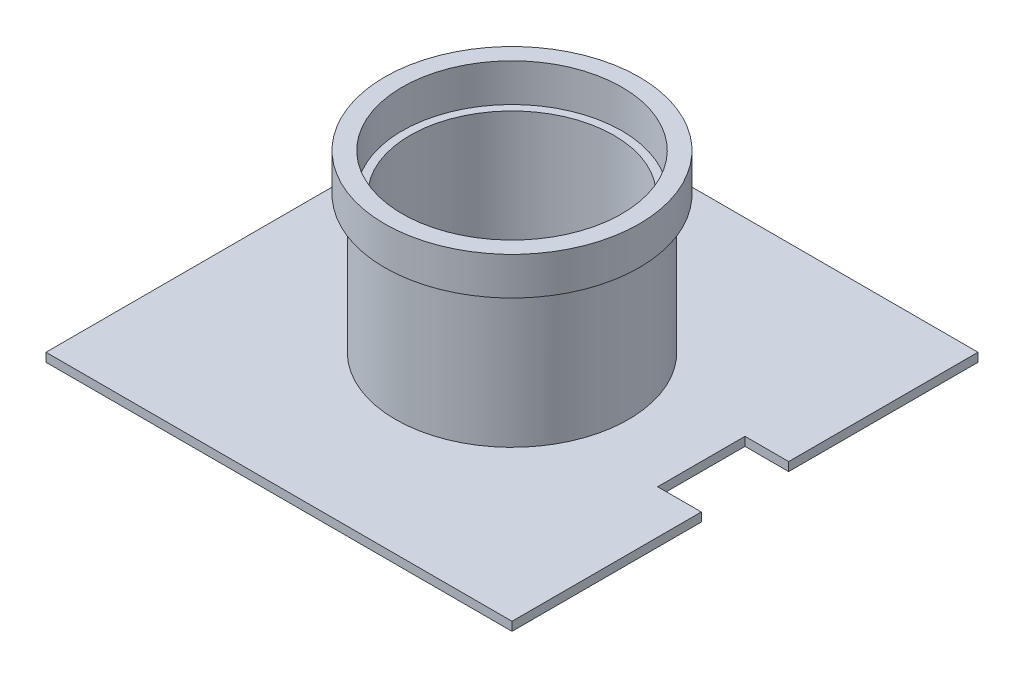
ISO-10303-21;
HEADER;
FILE_DESCRIPTION(('STEP AP214'),'2;1');
FILE_NAME('part.step','',(''),(''),'','','');
FILE_SCHEMA(('AUTOMOTIVE_DESIGN { 1 0 10303 214 1 1 1 1 }'));
ENDSEC;
DATA;
#1=APPLICATION_CONTEXT('core data for automotive mechanical design processes');
#2=APPLICATION_PROTOCOL_DEFINITION('international standard','automotive_design',2000,#1);
#3=PRODUCT_CONTEXT('',#1,'mechanical');
#4=PRODUCT('Part','Part','',(#3));
#5=PRODUCT_RELATED_PRODUCT_CATEGORY('part','',(#4));
#6=PRODUCT_DEFINITION_FORMATION('','',#4);
#7=PRODUCT_DEFINITION_CONTEXT('part definition',#1,'design');
#8=PRODUCT_DEFINITION('design','',#6,#7);
#9=PRODUCT_DEFINITION_SHAPE('','',#8);
#10=(LENGTH_UNIT() NAMED_UNIT(*) SI_UNIT(.MILLI.,.METRE.));
#11=(NAMED_UNIT(*) PLANE_ANGLE_UNIT() SI_UNIT($,.RADIAN.));
#12=(NAMED_UNIT(*) SI_UNIT($,.STERADIAN.) SOLID_ANGLE_UNIT());
#13=UNCERTAINTY_MEASURE_WITH_UNIT(LENGTH_MEASURE(1.E-05),#10,'distance_accuracy_value','');
#14=(GEOMETRIC_REPRESENTATION_CONTEXT(3) GLOBAL_UNCERTAINTY_ASSIGNED_CONTEXT((#13)) GLOBAL_UNIT_ASSIGNED_CONTEXT((#10,
#11,#12)) REPRESENTATION_CONTEXT('',''));
#15=CARTESIAN_POINT('',(0.,0.,0.));
#16=DIRECTION('',(0.,0.,1.));
#17=DIRECTION('',(1.,0.,0.));
#18=AXIS2_PLACEMENT_3D('',#15,#16,#17);
#19=CARTESIAN_POINT('',(0.,-47.,80.));
#20=DIRECTION('',(0.,0.,1.));
#21=DIRECTION('',(1.,0.,0.));
#22=AXIS2_PLACEMENT_3D('',#19,#20,#21);
#23=PLANE('',#22);
#24=DIRECTION('',(-1.,0.,0.));
#25=VECTOR('',#24,1.);
#26=CARTESIAN_POINT('',(0.,-50.,80.));
#27=LINE('',#26,#25);
#28=CARTESIAN_POINT('',(80.,-50.,80.));
#29=VERTEX_POINT('',#28);
#30=CARTESIAN_POINT('',(-80.,-50.,80.));
#31=VERTEX_POINT('',#30);
#32=EDGE_CURVE('E167',#29,#31,#27,.T.);
#33=ORIENTED_EDGE('',*,*,#32,.F.);
#34=DIRECTION('',(0.,-1.,0.));
#35=VECTOR('',#34,1.);
#36=CARTESIAN_POINT('',(80.,-47.,80.));
#37=LINE('',#36,#35);
#38=CARTESIAN_POINT('',(80.,-47.,80.));
#39=VERTEX_POINT('',#38);
#40=EDGE_CURVE('E12',#39,#29,#37,.T.);
#41=ORIENTED_EDGE('',*,*,#40,.F.);
#42=DIRECTION('',(-1.,0.,0.));
#43=VECTOR('',#42,1.);
#44=CARTESIAN_POINT('',(0.,-47.,80.));
#45=LINE('',#44,#43);
#46=CARTESIAN_POINT('',(-80.,-47.,80.));
#47=VERTEX_POINT('',#46);
#48=EDGE_CURVE('E71',#39,#47,#45,.T.);
#49=ORIENTED_EDGE('',*,*,#48,.T.);
#50=DIRECTION('',(0.,-1.,0.));
#51=VECTOR('',#50,1.);
#52=CARTESIAN_POINT('',(-80.,-47.,80.));
#53=LINE('',#52,#51);
#54=EDGE_CURVE('E56',#47,#31,#53,.T.);
#55=ORIENTED_EDGE('',*,*,#54,.T.);
#56=EDGE_LOOP('',(#33,#41,#49,#55));
#57=FACE_BOUND('',#56,.T.);
#58=ADVANCED_FACE('F52',(#57),#23,.T.);
#59=CARTESIAN_POINT('',(80.,-47.,80.));
#60=DIRECTION('',(1.,0.,0.));
#61=DIRECTION('',(0.,0.,-1.));
#62=AXIS2_PLACEMENT_3D('',#59,#60,#61);
#63=PLANE('',#62);
#64=DIRECTION('',(0.,0.,1.));
#65=VECTOR('',#64,1.);
#66=CARTESIAN_POINT('',(80.,-50.,80.));
#67=LINE('',#66,#65);
#68=CARTESIAN_POINT('',(80.,-50.,15.));
#69=VERTEX_POINT('',#68);
#70=EDGE_CURVE('E165',#69,#29,#67,.T.);
#71=ORIENTED_EDGE('',*,*,#70,.F.);
#72=DIRECTION('',(0.,-1.,0.));
#73=VECTOR('',#72,1.);
#74=CARTESIAN_POINT('',(80.,-47.,15.));
#75=LINE('',#74,#73);
#76=CARTESIAN_POINT('',(80.,-47.,15.));
#77=VERTEX_POINT('',#76);
#78=EDGE_CURVE('E62',#77,#69,#75,.T.);
#79=ORIENTED_EDGE('',*,*,#78,.F.);
#80=DIRECTION('',(0.,0.,1.));
#81=VECTOR('',#80,1.);
#82=CARTESIAN_POINT('',(80.,-47.,80.));
#83=LINE('',#82,#81);
#84=EDGE_CURVE('E144',#77,#39,#83,.T.);
#85=ORIENTED_EDGE('',*,*,#84,.T.);
#86=ORIENTED_EDGE('',*,*,#40,.T.);
#87=EDGE_LOOP('',(#71,#79,#85,#86));
#88=FACE_BOUND('',#87,.T.);
#89=ADVANCED_FACE('F180',(#88),#63,.T.);
#90=CARTESIAN_POINT('',(65.,-47.,15.));
#91=DIRECTION('',(0.,0.,-1.));
#92=DIRECTION('',(-1.,0.,0.));
#93=AXIS2_PLACEMENT_3D('',#90,#91,#92);
#94=PLANE('',#93);
#95=DIRECTION('',(1.,0.,0.));
#96=VECTOR('',#95,1.);
#97=CARTESIAN_POINT('',(65.,-50.,15.));
#98=LINE('',#97,#96);
#99=CARTESIAN_POINT('',(65.,-50.,15.));
#100=VERTEX_POINT('',#99);
#101=EDGE_CURVE('E140',#100,#69,#98,.T.);
#102=ORIENTED_EDGE('',*,*,#101,.F.);
#103=DIRECTION('',(0.,-1.,0.));
#104=VECTOR('',#103,1.);
#105=CARTESIAN_POINT('',(65.,-47.,15.));
#106=LINE('',#105,#104);
#107=CARTESIAN_POINT('',(65.,-47.,15.));
#108=VERTEX_POINT('',#107);
#109=EDGE_CURVE('E129',#108,#100,#106,.T.);
#110=ORIENTED_EDGE('',*,*,#109,.F.);
#111=DIRECTION('',(1.,0.,0.));
#112=VECTOR('',#111,1.);
#113=CARTESIAN_POINT('',(65.,-47.,15.));
#114=LINE('',#113,#112);
#115=EDGE_CURVE('E135',#108,#77,#114,.T.);
#116=ORIENTED_EDGE('',*,*,#115,.T.);
#117=ORIENTED_EDGE('',*,*,#78,.T.);
#118=EDGE_LOOP('',(#102,#110,#116,#117));
#119=FACE_BOUND('',#118,.T.);
#120=ADVANCED_FACE('F138',(#119),#94,.T.);
#121=CARTESIAN_POINT('',(65.,-47.,0.));
#122=DIRECTION('',(1.,0.,0.));
#123=DIRECTION('',(0.,0.,-1.));
#124=AXIS2_PLACEMENT_3D('',#121,#122,#123);
#125=PLANE('',#124);
#126=DIRECTION('',(0.,0.,1.));
#127=VECTOR('',#126,1.);
#128=CARTESIAN_POINT('',(65.,-50.,0.));
#129=LINE('',#128,#127);
#130=CARTESIAN_POINT('',(65.,-50.,-15.));
#131=VERTEX_POINT('',#130);
#132=EDGE_CURVE('E162',#131,#100,#129,.T.);
#133=ORIENTED_EDGE('',*,*,#132,.F.);
#134=DIRECTION('',(0.,-1.,0.));
#135=VECTOR('',#134,1.);
#136=CARTESIAN_POINT('',(65.,-47.,-15.));
#137=LINE('',#136,#135);
#138=CARTESIAN_POINT('',(65.,-47.,-15.));
#139=VERTEX_POINT('',#138);
#140=EDGE_CURVE('E131',#139,#131,#137,.T.);
#141=ORIENTED_EDGE('',*,*,#140,.F.);
#142=DIRECTION('',(0.,0.,1.));
#143=VECTOR('',#142,1.);
#144=CARTESIAN_POINT('',(65.,-47.,0.));
#145=LINE('',#144,#143);
#146=EDGE_CURVE('E126',#139,#108,#145,.T.);
#147=ORIENTED_EDGE('',*,*,#146,.T.);
#148=ORIENTED_EDGE('',*,*,#109,.T.);
#149=EDGE_LOOP('',(#133,#141,#147,#148));
#150=FACE_BOUND('',#149,.T.);
#151=ADVANCED_FACE('F128',(#150),#125,.T.);
#152=CARTESIAN_POINT('',(65.,-47.,-15.));
#153=DIRECTION('',(0.,0.,1.));
#154=DIRECTION('',(1.,0.,0.));
#155=AXIS2_PLACEMENT_3D('',#152,#153,#154);
#156=PLANE('',#155);
#157=DIRECTION('',(-1.,0.,0.));
#158=VECTOR('',#157,1.);
#159=CARTESIAN_POINT('',(65.,-50.,-15.));
#160=LINE('',#159,#158);
#161=CARTESIAN_POINT('',(80.,-50.,-15.));
#162=VERTEX_POINT('',#161);
#163=EDGE_CURVE('E159',#162,#131,#160,.T.);
#164=ORIENTED_EDGE('',*,*,#163,.F.);
#165=DIRECTION('',(0.,-1.,0.));
#166=VECTOR('',#165,1.);
#167=CARTESIAN_POINT('',(80.,-47.,-15.));
#168=LINE('',#167,#166);
#169=CARTESIAN_POINT('',(80.,-47.,-15.));
#170=VERTEX_POINT('',#169);
#171=EDGE_CURVE('E171',#170,#162,#168,.T.);
#172=ORIENTED_EDGE('',*,*,#171,.F.);
#173=DIRECTION('',(-1.,0.,0.));
#174=VECTOR('',#173,1.);
#175=CARTESIAN_POINT('',(65.,-47.,-15.));
#176=LINE('',#175,#174);
#177=EDGE_CURVE('E136',#170,#139,#176,.T.);
#178=ORIENTED_EDGE('',*,*,#177,.T.);
#179=ORIENTED_EDGE('',*,*,#140,.T.);
#180=EDGE_LOOP('',(#164,#172,#178,#179));
#181=FACE_BOUND('',#180,.T.);
#182=ADVANCED_FACE('F193',(#181),#156,.T.);
#183=CARTESIAN_POINT('',(80.,-47.,-15.));
#184=DIRECTION('',(1.,0.,0.));
#185=DIRECTION('',(0.,0.,-1.));
#186=AXIS2_PLACEMENT_3D('',#183,#184,#185);
#187=PLANE('',#186);
#188=DIRECTION('',(0.,0.,1.));
#189=VECTOR('',#188,1.);
#190=CARTESIAN_POINT('',(80.,-50.,-15.));
#191=LINE('',#190,#189);
#192=CARTESIAN_POINT('',(80.,-50.,-80.));
#193=VERTEX_POINT('',#192);
#194=EDGE_CURVE('E156',#193,#162,#191,.T.);
#195=ORIENTED_EDGE('',*,*,#194,.F.);
#196=DIRECTION('',(0.,-1.,0.));
#197=VECTOR('',#196,1.);
#198=CARTESIAN_POINT('',(80.,-47.,-80.));
#199=LINE('',#198,#197);
#200=CARTESIAN_POINT('',(80.,-47.,-80.));
#201=VERTEX_POINT('',#200);
#202=EDGE_CURVE('E173',#201,#193,#199,.T.);
#203=ORIENTED_EDGE('',*,*,#202,.F.);
#204=DIRECTION('',(0.,0.,1.));
#205=VECTOR('',#204,1.);
#206=CARTESIAN_POINT('',(80.,-47.,-15.));
#207=LINE('',#206,#205);
#208=EDGE_CURVE('E213',#201,#170,#207,.T.);
#209=ORIENTED_EDGE('',*,*,#208,.T.);
#210=ORIENTED_EDGE('',*,*,#171,.T.);
#211=EDGE_LOOP('',(#195,#203,#209,#210));
#212=FACE_BOUND('',#211,.T.);
#213=ADVANCED_FACE('F196',(#212),#187,.T.);
#214=CARTESIAN_POINT('',(80.,-47.,-80.));
#215=DIRECTION('',(0.,0.,-1.));
#216=DIRECTION('',(-1.,0.,0.));
#217=AXIS2_PLACEMENT_3D('',#214,#215,#216);
#218=PLANE('',#217);
#219=DIRECTION('',(1.,0.,0.));
#220=VECTOR('',#219,1.);
#221=CARTESIAN_POINT('',(80.,-50.,-80.));
#222=LINE('',#221,#220);
#223=CARTESIAN_POINT('',(-80.,-50.,-80.));
#224=VERTEX_POINT('',#223);
#225=EDGE_CURVE('E152',#224,#193,#222,.T.);
#226=ORIENTED_EDGE('',*,*,#225,.F.);
#227=DIRECTION('',(0.,-1.,0.));
#228=VECTOR('',#227,1.);
#229=CARTESIAN_POINT('',(-80.,-47.,-80.));
#230=LINE('',#229,#228);
#231=CARTESIAN_POINT('',(-80.,-47.,-80.));
#232=VERTEX_POINT('',#231);
#233=EDGE_CURVE('E174',#232,#224,#230,.T.);
#234=ORIENTED_EDGE('',*,*,#233,.F.);
#235=DIRECTION('',(1.,0.,0.));
#236=VECTOR('',#235,1.);
#237=CARTESIAN_POINT('',(80.,-47.,-80.));
#238=LINE('',#237,#236);
#239=EDGE_CURVE('E209',#232,#201,#238,.T.);
#240=ORIENTED_EDGE('',*,*,#239,.T.);
#241=ORIENTED_EDGE('',*,*,#202,.T.);
#242=EDGE_LOOP('',(#226,#234,#240,#241));
#243=FACE_BOUND('',#242,.T.);
#244=ADVANCED_FACE('F199',(#243),#218,.T.);
#245=CARTESIAN_POINT('',(-80.,-47.,80.));
#246=DIRECTION('',(-1.,0.,0.));
#247=DIRECTION('',(0.,0.,1.));
#248=AXIS2_PLACEMENT_3D('',#245,#246,#247);
#249=PLANE('',#248);
#250=DIRECTION('',(0.,0.,-1.));
#251=VECTOR('',#250,1.);
#252=CARTESIAN_POINT('',(-80.,-50.,80.));
#253=LINE('',#252,#251);
#254=EDGE_CURVE('E149',#31,#224,#253,.T.);
#255=ORIENTED_EDGE('',*,*,#254,.F.);
#256=ORIENTED_EDGE('',*,*,#54,.F.);
#257=DIRECTION('',(0.,0.,-1.));
#258=VECTOR('',#257,1.);
#259=CARTESIAN_POINT('',(-80.,-47.,80.));
#260=LINE('',#259,#258);
#261=EDGE_CURVE('E217',#47,#232,#260,.T.);
#262=ORIENTED_EDGE('',*,*,#261,.T.);
#263=ORIENTED_EDGE('',*,*,#233,.T.);
#264=EDGE_LOOP('',(#255,#256,#262,#263));
#265=FACE_BOUND('',#264,.T.);
#266=ADVANCED_FACE('F54',(#265),#249,.T.);
#267=CARTESIAN_POINT('',(0.,-47.,0.));
#268=DIRECTION('',(0.,-1.,0.));
#269=DIRECTION('',(0.,0.,-1.));
#270=AXIS2_PLACEMENT_3D('',#267,#268,#269);
#271=PLANE('',#270);
#272=CARTESIAN_POINT('',(0.,-47.,0.));
#273=DIRECTION('',(0.,-1.,0.));
#274=DIRECTION('',(0.,0.,-1.));
#275=AXIS2_PLACEMENT_3D('',#272,#273,#274);
#276=CIRCLE('',#275,35.);
#277=CARTESIAN_POINT('',(0.,-47.,-35.));
#278=VERTEX_POINT('',#277);
#279=EDGE_CURVE('E153',#278,#278,#276,.T.);
#280=ORIENTED_EDGE('',*,*,#279,.T.);
#281=EDGE_LOOP('',(#280));
#282=FACE_BOUND('',#281,.T.);
#283=ORIENTED_EDGE('',*,*,#48,.F.);
#284=ORIENTED_EDGE('',*,*,#84,.F.);
#285=ORIENTED_EDGE('',*,*,#115,.F.);
#286=ORIENTED_EDGE('',*,*,#146,.F.);
#287=ORIENTED_EDGE('',*,*,#177,.F.);
#288=ORIENTED_EDGE('',*,*,#208,.F.);
#289=ORIENTED_EDGE('',*,*,#239,.F.);
#290=ORIENTED_EDGE('',*,*,#261,.F.);
#291=EDGE_LOOP('',(#283,#284,#285,#286,#287,#288,#289,#290));
#292=FACE_BOUND('',#291,.T.);
#293=ADVANCED_FACE('F143',(#282,#292),#271,.F.);
#294=CARTESIAN_POINT('',(0.,-50.,0.));
#295=DIRECTION('',(0.,-1.,0.));
#296=DIRECTION('',(0.,0.,-1.));
#297=AXIS2_PLACEMENT_3D('',#294,#295,#296);
#298=PLANE('',#297);
#299=CARTESIAN_POINT('',(0.,-50.,0.));
#300=DIRECTION('',(0.,-1.,0.));
#301=DIRECTION('',(0.,0.,-1.));
#302=AXIS2_PLACEMENT_3D('',#299,#300,#301);
#303=CIRCLE('',#302,35.);
#304=CARTESIAN_POINT('',(0.,-50.,-35.));
#305=VERTEX_POINT('',#304);
#306=EDGE_CURVE('E220',#305,#305,#303,.T.);
#307=ORIENTED_EDGE('',*,*,#306,.F.);
#308=EDGE_LOOP('',(#307));
#309=FACE_BOUND('',#308,.T.);
#310=ORIENTED_EDGE('',*,*,#32,.T.);
#311=ORIENTED_EDGE('',*,*,#254,.T.);
#312=ORIENTED_EDGE('',*,*,#225,.T.);
#313=ORIENTED_EDGE('',*,*,#194,.T.);
#314=ORIENTED_EDGE('',*,*,#163,.T.);
#315=ORIENTED_EDGE('',*,*,#132,.T.);
#316=ORIENTED_EDGE('',*,*,#101,.T.);
#317=ORIENTED_EDGE('',*,*,#70,.T.);
#318=EDGE_LOOP('',(#310,#311,#312,#313,#314,#315,#316,#317));
#319=FACE_BOUND('',#318,.T.);
#320=ADVANCED_FACE('F179',(#309,#319),#298,.T.);
#321=CARTESIAN_POINT('',(0.,-47.,0.));
#322=DIRECTION('',(0.,-1.,0.));
#323=DIRECTION('',(0.,0.,-1.));
#324=AXIS2_PLACEMENT_3D('',#321,#322,#323);
#325=CYLINDRICAL_SURFACE('',#324,35.);
#326=ORIENTED_EDGE('',*,*,#279,.F.);
#327=EDGE_LOOP('',(#326));
#328=FACE_BOUND('',#327,.T.);
#329=ORIENTED_EDGE('',*,*,#306,.T.);
#330=EDGE_LOOP('',(#329));
#331=FACE_BOUND('',#330,.T.);
#332=ADVANCED_FACE('F227',(#328,#331),#325,.F.);
#333=CLOSED_SHELL('',(#58,#89,#120,#151,#182,#213,#244,#266,#293,#320,#332));
#334=MANIFOLD_SOLID_BREP('B2',#333);
#335=CARTESIAN_POINT('',(0.,13.,0.));
#336=DIRECTION('',(0.,1.,0.));
#337=DIRECTION('',(0.,0.,1.));
#338=AXIS2_PLACEMENT_3D('',#335,#336,#337);
#339=PLANE('',#338);
#340=CARTESIAN_POINT('',(0.,13.,0.));
#341=DIRECTION('',(0.,1.,0.));
#342=DIRECTION('',(0.,0.,1.));
#343=AXIS2_PLACEMENT_3D('',#340,#341,#342);
#344=CIRCLE('',#343,43.7);
#345=CARTESIAN_POINT('',(0.,13.,-43.7));
#346=VERTEX_POINT('',#345);
#347=EDGE_CURVE('E314',#346,#346,#344,.T.);
#348=ORIENTED_EDGE('',*,*,#347,.T.);
#349=EDGE_LOOP('',(#348));
#350=FACE_BOUND('',#349,.T.);
#351=CARTESIAN_POINT('',(0.,13.,0.));
#352=DIRECTION('',(0.,1.,0.));
#353=DIRECTION('',(0.,0.,1.));
#354=AXIS2_PLACEMENT_3D('',#351,#352,#353);
#355=CIRCLE('',#354,37.7);
#356=CARTESIAN_POINT('',(0.,13.,-37.7));
#357=VERTEX_POINT('',#356);
#358=EDGE_CURVE('E325',#357,#357,#355,.T.);
#359=ORIENTED_EDGE('',*,*,#358,.F.);
#360=EDGE_LOOP('',(#359));
#361=FACE_BOUND('',#360,.T.);
#362=ADVANCED_FACE('F306',(#350,#361),#339,.T.);
#363=CARTESIAN_POINT('',(0.,0.,0.));
#364=DIRECTION('',(0.,1.,0.));
#365=DIRECTION('',(0.,0.,1.));
#366=AXIS2_PLACEMENT_3D('',#363,#364,#365);
#367=PLANE('',#366);
#368=CARTESIAN_POINT('',(0.,0.,0.));
#369=DIRECTION('',(0.,1.,0.));
#370=DIRECTION('',(0.,0.,1.));
#371=AXIS2_PLACEMENT_3D('',#368,#369,#370);
#372=CIRCLE('',#371,40.);
#373=CARTESIAN_POINT('',(0.,0.,40.));
#374=VERTEX_POINT('',#373);
#375=EDGE_CURVE('E51',#374,#374,#372,.F.);
#376=ORIENTED_EDGE('',*,*,#375,.F.);
#377=EDGE_LOOP('',(#376));
#378=FACE_BOUND('',#377,.T.);
#379=CARTESIAN_POINT('',(0.,0.,0.));
#380=DIRECTION('',(0.,1.,0.));
#381=DIRECTION('',(0.,0.,1.));
#382=AXIS2_PLACEMENT_3D('',#379,#380,#381);
#383=CIRCLE('',#382,43.7);
#384=CARTESIAN_POINT('',(0.,0.,-43.7));
#385=VERTEX_POINT('',#384);
#386=EDGE_CURVE('E319',#385,#385,#383,.T.);
#387=ORIENTED_EDGE('',*,*,#386,.F.);
#388=EDGE_LOOP('',(#387));
#389=FACE_BOUND('',#388,.T.);
#390=ADVANCED_FACE('F367',(#378,#389),#367,.F.);
#391=CARTESIAN_POINT('',(0.,13.,0.));
#392=DIRECTION('',(0.,-1.,0.));
#393=DIRECTION('',(0.,0.,-1.));
#394=AXIS2_PLACEMENT_3D('',#391,#392,#393);
#395=CYLINDRICAL_SURFACE('',#394,43.7);
#396=CARTESIAN_POINT('',(0.,13.,-43.7));
#397=CARTESIAN_POINT('',(0.,12.8645833333333,-43.7));
#398=CARTESIAN_POINT('',(0.,12.7291666666667,-43.7));
#399=CARTESIAN_POINT('',(0.,12.4583333333333,-43.7));
#400=CARTESIAN_POINT('',(0.,12.3229166666667,-43.7));
#401=CARTESIAN_POINT('',(0.,12.0520833333333,-43.7));
#402=CARTESIAN_POINT('',(0.,11.9166666666667,-43.7));
#403=CARTESIAN_POINT('',(0.,11.6458333333333,-43.7));
#404=CARTESIAN_POINT('',(0.,11.5104166666667,-43.7));
#405=CARTESIAN_POINT('',(0.,11.2395833333333,-43.7));
#406=CARTESIAN_POINT('',(0.,11.1041666666667,-43.7));
#407=CARTESIAN_POINT('',(0.,10.8333333333333,-43.7));
#408=CARTESIAN_POINT('',(0.,10.6979166666667,-43.7));
#409=CARTESIAN_POINT('',(0.,10.4270833333333,-43.7));
#410=CARTESIAN_POINT('',(0.,10.2916666666667,-43.7));
#411=CARTESIAN_POINT('',(0.,10.0208333333333,-43.7));
#412=CARTESIAN_POINT('',(0.,9.88541666666667,-43.7));
#413=CARTESIAN_POINT('',(0.,9.61458333333333,-43.7));
#414=CARTESIAN_POINT('',(0.,9.47916666666667,-43.7));
#415=CARTESIAN_POINT('',(0.,9.20833333333333,-43.7));
#416=CARTESIAN_POINT('',(0.,9.07291666666667,-43.7));
#417=CARTESIAN_POINT('',(0.,8.80208333333333,-43.7));
#418=CARTESIAN_POINT('',(0.,8.66666666666667,-43.7));
#419=CARTESIAN_POINT('',(0.,8.39583333333333,-43.7));
#420=CARTESIAN_POINT('',(0.,8.26041666666667,-43.7));
#421=CARTESIAN_POINT('',(0.,7.98958333333333,-43.7));
#422=CARTESIAN_POINT('',(0.,7.85416666666667,-43.7));
#423=CARTESIAN_POINT('',(0.,7.58333333333333,-43.7));
#424=CARTESIAN_POINT('',(0.,7.44791666666667,-43.7));
#425=CARTESIAN_POINT('',(0.,7.17708333333333,-43.7));
#426=CARTESIAN_POINT('',(0.,7.04166666666667,-43.7));
#427=CARTESIAN_POINT('',(0.,6.77083333333333,-43.7));
#428=CARTESIAN_POINT('',(0.,6.63541666666667,-43.7));
#429=CARTESIAN_POINT('',(0.,6.36458333333333,-43.7));
#430=CARTESIAN_POINT('',(0.,6.22916666666667,-43.7));
#431=CARTESIAN_POINT('',(0.,5.95833333333333,-43.7));
#432=CARTESIAN_POINT('',(0.,5.82291666666667,-43.7));
#433=CARTESIAN_POINT('',(0.,5.55208333333333,-43.7));
#434=CARTESIAN_POINT('',(0.,5.41666666666667,-43.7));
#435=CARTESIAN_POINT('',(0.,5.14583333333333,-43.7));
#436=CARTESIAN_POINT('',(0.,5.01041666666667,-43.7));
#437=CARTESIAN_POINT('',(0.,4.73958333333333,-43.7));
#438=CARTESIAN_POINT('',(0.,4.60416666666667,-43.7));
#439=CARTESIAN_POINT('',(0.,4.33333333333333,-43.7));
#440=CARTESIAN_POINT('',(0.,4.19791666666667,-43.7));
#441=CARTESIAN_POINT('',(0.,3.92708333333333,-43.7));
#442=CARTESIAN_POINT('',(0.,3.79166666666667,-43.7));
#443=CARTESIAN_POINT('',(0.,3.52083333333333,-43.7));
#444=CARTESIAN_POINT('',(0.,3.38541666666667,-43.7));
#445=CARTESIAN_POINT('',(0.,3.11458333333333,-43.7));
#446=CARTESIAN_POINT('',(0.,2.97916666666667,-43.7));
#447=CARTESIAN_POINT('',(0.,2.70833333333333,-43.7));
#448=CARTESIAN_POINT('',(0.,2.57291666666667,-43.7));
#449=CARTESIAN_POINT('',(0.,2.30208333333333,-43.7));
#450=CARTESIAN_POINT('',(0.,2.16666666666667,-43.7));
#451=CARTESIAN_POINT('',(0.,1.89583333333333,-43.7));
#452=CARTESIAN_POINT('',(0.,1.76041666666667,-43.7));
#453=CARTESIAN_POINT('',(0.,1.48958333333333,-43.7));
#454=CARTESIAN_POINT('',(0.,1.35416666666667,-43.7));
#455=CARTESIAN_POINT('',(0.,1.08333333333333,-43.7));
#456=CARTESIAN_POINT('',(0.,0.947916666666667,-43.7));
#457=CARTESIAN_POINT('',(0.,0.677083333333334,-43.7));
#458=CARTESIAN_POINT('',(0.,0.541666666666667,-43.7));
#459=CARTESIAN_POINT('',(0.,0.270833333333334,-43.7));
#460=CARTESIAN_POINT('',(0.,0.135416666666667,-43.7));
#461=CARTESIAN_POINT('',(0.,0.,-43.7));
#462=B_SPLINE_CURVE_WITH_KNOTS('',3,(#396,#397,#398,#399,#400,#401,#402,#403,#404,#405,#406,
#407,#408,#409,#410,#411,#412,#413,#414,#415,#416,#417,#418,#419,#420,#421,#422,#423,#424,#425,
#426,#427,#428,#429,#430,#431,#432,#433,#434,#435,#436,#437,#438,#439,#440,#441,#442,#443,#444,
#445,#446,#447,#448,#449,#450,#451,#452,#453,#454,#455,#456,#457,#458,#459,#460,#461),
.UNSPECIFIED.,.F.,.F.,(4,2,2,2,2,2,2,2,2,2,2,2,2,2,2,2,2,2,2,2,2,2,2,2,2,2,2,2,2,2,2,2,4),(0.,
0.406249999999999,0.812499999999999,1.21875,1.625,2.03125,2.4375,2.84375,3.25,3.65625,4.0625,
4.46875,4.875,5.28125,5.6875,6.09375,6.5,6.90625,7.3125,7.71875,8.125,8.53125,8.9375,9.34375,
9.75,10.15625,10.5625,10.96875,11.375,11.78125,12.1875,12.59375,13.),.UNSPECIFIED.);
#463=EDGE_CURVE('BSEAM308',#346,#385,#462,.T.);
#464=ORIENTED_EDGE('',*,*,#347,.F.);
#465=ORIENTED_EDGE('',*,*,#386,.T.);
#466=ORIENTED_EDGE('',*,*,#463,.T.);
#467=ORIENTED_EDGE('',*,*,#463,.F.);
#468=EDGE_LOOP('',(#464,#466,#465,#467));
#469=FACE_BOUND('',#468,.T.);
#470=ADVANCED_FACE('F308',(#469),#395,.T.);
#471=CARTESIAN_POINT('',(0.,13.,0.));
#472=DIRECTION('',(0.,-1.,0.));
#473=DIRECTION('',(0.,0.,-1.));
#474=AXIS2_PLACEMENT_3D('',#471,#472,#473);
#475=CYLINDRICAL_SURFACE('',#474,37.7);
#476=CARTESIAN_POINT('',(0.,0.,0.));
#477=DIRECTION('',(0.,1.,0.));
#478=DIRECTION('',(0.,0.,1.));
#479=AXIS2_PLACEMENT_3D('',#476,#477,#478);
#480=CIRCLE('',#479,37.7);
#481=CARTESIAN_POINT('',(0.,0.,-37.7));
#482=VERTEX_POINT('',#481);
#483=EDGE_CURVE('E327',#482,#482,#480,.T.);
#484=CARTESIAN_POINT('',(0.,13.,-37.7));
#485=CARTESIAN_POINT('',(0.,12.8645833333333,-37.7));
#486=CARTESIAN_POINT('',(0.,12.7291666666667,-37.7));
#487=CARTESIAN_POINT('',(0.,12.4583333333333,-37.7));
#488=CARTESIAN_POINT('',(0.,12.3229166666667,-37.7));
#489=CARTESIAN_POINT('',(0.,12.0520833333333,-37.7));
#490=CARTESIAN_POINT('',(0.,11.9166666666667,-37.7));
#491=CARTESIAN_POINT('',(0.,11.6458333333333,-37.7));
#492=CARTESIAN_POINT('',(0.,11.5104166666667,-37.7));
#493=CARTESIAN_POINT('',(0.,11.2395833333333,-37.7));
#494=CARTESIAN_POINT('',(0.,11.1041666666667,-37.7));
#495=CARTESIAN_POINT('',(0.,10.8333333333333,-37.7));
#496=CARTESIAN_POINT('',(0.,10.6979166666667,-37.7));
#497=CARTESIAN_POINT('',(0.,10.4270833333333,-37.7));
#498=CARTESIAN_POINT('',(0.,10.2916666666667,-37.7));
#499=CARTESIAN_POINT('',(0.,10.0208333333333,-37.7));
#500=CARTESIAN_POINT('',(0.,9.88541666666667,-37.7));
#501=CARTESIAN_POINT('',(0.,9.61458333333333,-37.7));
#502=CARTESIAN_POINT('',(0.,9.47916666666667,-37.7));
#503=CARTESIAN_POINT('',(0.,9.20833333333333,-37.7));
#504=CARTESIAN_POINT('',(0.,9.07291666666666,-37.7));
#505=CARTESIAN_POINT('',(0.,8.80208333333333,-37.7));
#506=CARTESIAN_POINT('',(0.,8.66666666666667,-37.7));
#507=CARTESIAN_POINT('',(0.,8.39583333333333,-37.7));
#508=CARTESIAN_POINT('',(0.,8.26041666666667,-37.7));
#509=CARTESIAN_POINT('',(0.,7.98958333333333,-37.7));
#510=CARTESIAN_POINT('',(0.,7.85416666666667,-37.7));
#511=CARTESIAN_POINT('',(0.,7.58333333333333,-37.7));
#512=CARTESIAN_POINT('',(0.,7.44791666666667,-37.7));
#513=CARTESIAN_POINT('',(0.,7.17708333333333,-37.7));
#514=CARTESIAN_POINT('',(0.,7.04166666666667,-37.7));
#515=CARTESIAN_POINT('',(0.,6.77083333333333,-37.7));
#516=CARTESIAN_POINT('',(0.,6.63541666666667,-37.7));
#517=CARTESIAN_POINT('',(0.,6.36458333333333,-37.7));
#518=CARTESIAN_POINT('',(0.,6.22916666666667,-37.7));
#519=CARTESIAN_POINT('',(0.,5.95833333333333,-37.7));
#520=CARTESIAN_POINT('',(0.,5.82291666666667,-37.7));
#521=CARTESIAN_POINT('',(0.,5.55208333333333,-37.7));
#522=CARTESIAN_POINT('',(0.,5.41666666666667,-37.7));
#523=CARTESIAN_POINT('',(0.,5.14583333333333,-37.7));
#524=CARTESIAN_POINT('',(0.,5.01041666666667,-37.7));
#525=CARTESIAN_POINT('',(0.,4.73958333333333,-37.7));
#526=CARTESIAN_POINT('',(0.,4.60416666666667,-37.7));
#527=CARTESIAN_POINT('',(0.,4.33333333333333,-37.7));
#528=CARTESIAN_POINT('',(0.,4.19791666666667,-37.7));
#529=CARTESIAN_POINT('',(0.,3.92708333333333,-37.7));
#530=CARTESIAN_POINT('',(0.,3.79166666666667,-37.7));
#531=CARTESIAN_POINT('',(0.,3.52083333333333,-37.7));
#532=CARTESIAN_POINT('',(0.,3.38541666666667,-37.7));
#533=CARTESIAN_POINT('',(0.,3.11458333333333,-37.7));
#534=CARTESIAN_POINT('',(0.,2.97916666666667,-37.7));
#535=CARTESIAN_POINT('',(0.,2.70833333333333,-37.7));
#536=CARTESIAN_POINT('',(0.,2.57291666666667,-37.7));
#537=CARTESIAN_POINT('',(0.,2.30208333333333,-37.7));
#538=CARTESIAN_POINT('',(0.,2.16666666666667,-37.7));
#539=CARTESIAN_POINT('',(0.,1.89583333333333,-37.7));
#540=CARTESIAN_POINT('',(0.,1.76041666666667,-37.7));
#541=CARTESIAN_POINT('',(0.,1.48958333333333,-37.7));
#542=CARTESIAN_POINT('',(0.,1.35416666666667,-37.7));
#543=CARTESIAN_POINT('',(0.,1.08333333333333,-37.7));
#544=CARTESIAN_POINT('',(0.,0.947916666666667,-37.7));
#545=CARTESIAN_POINT('',(0.,0.677083333333334,-37.7));
#546=CARTESIAN_POINT('',(0.,0.541666666666667,-37.7));
#547=CARTESIAN_POINT('',(0.,0.270833333333334,-37.7));
#548=CARTESIAN_POINT('',(0.,0.135416666666667,-37.7));
#549=CARTESIAN_POINT('',(0.,0.,-37.7));
#550=B_SPLINE_CURVE_WITH_KNOTS('',3,(#484,#485,#486,#487,#488,#489,#490,#491,#492,#493,#494,
#495,#496,#497,#498,#499,#500,#501,#502,#503,#504,#505,#506,#507,#508,#509,#510,#511,#512,#513,
#514,#515,#516,#517,#518,#519,#520,#521,#522,#523,#524,#525,#526,#527,#528,#529,#530,#531,#532,
#533,#534,#535,#536,#537,#538,#539,#540,#541,#542,#543,#544,#545,#546,#547,#548,#549),
.UNSPECIFIED.,.F.,.F.,(4,2,2,2,2,2,2,2,2,2,2,2,2,2,2,2,2,2,2,2,2,2,2,2,2,2,2,2,2,2,2,2,4),(0.,
0.40625,0.812500000000001,1.21875,1.625,2.03125,2.4375,2.84375,3.25,3.65625,4.0625,4.46875,
4.875,5.28125,5.6875,6.09375,6.5,6.90625,7.3125,7.71875,8.125,8.53125,8.9375,9.34375,9.75,
10.15625,10.5625,10.96875,11.375,11.78125,12.1875,12.59375,13.),.UNSPECIFIED.);
#551=EDGE_CURVE('BSEAM362',#357,#482,#550,.T.);
#552=ORIENTED_EDGE('',*,*,#358,.T.);
#553=ORIENTED_EDGE('',*,*,#483,.F.);
#554=ORIENTED_EDGE('',*,*,#551,.T.);
#555=ORIENTED_EDGE('',*,*,#551,.F.);
#556=EDGE_LOOP('',(#552,#554,#553,#555));
#557=FACE_BOUND('',#556,.T.);
#558=ADVANCED_FACE('F362',(#557),#475,.F.);
#559=CARTESIAN_POINT('',(0.,0.,0.));
#560=DIRECTION('',(0.,-1.,0.));
#561=DIRECTION('',(0.,0.,-1.));
#562=AXIS2_PLACEMENT_3D('',#559,#560,#561);
#563=PLANE('',#562);
#564=CARTESIAN_POINT('',(0.,0.,0.));
#565=DIRECTION('',(0.,-1.,0.));
#566=DIRECTION('',(0.,0.,-1.));
#567=AXIS2_PLACEMENT_3D('',#564,#565,#566);
#568=CIRCLE('',#567,35.);
#569=CARTESIAN_POINT('',(0.,0.,-35.));
#570=VERTEX_POINT('',#569);
#571=EDGE_CURVE('E339',#570,#570,#568,.T.);
#572=ORIENTED_EDGE('',*,*,#571,.T.);
#573=EDGE_LOOP('',(#572));
#574=FACE_BOUND('',#573,.T.);
#575=ORIENTED_EDGE('',*,*,#483,.T.);
#576=EDGE_LOOP('',(#575));
#577=FACE_BOUND('',#576,.T.);
#578=ADVANCED_FACE('F353',(#574,#577),#563,.F.);
#579=CARTESIAN_POINT('',(0.,-50.,0.));
#580=DIRECTION('',(0.,-1.,0.));
#581=DIRECTION('',(0.,0.,-1.));
#582=AXIS2_PLACEMENT_3D('',#579,#580,#581);
#583=PLANE('',#582);
#584=CARTESIAN_POINT('',(0.,-50.,0.));
#585=DIRECTION('',(0.,-1.,0.));
#586=DIRECTION('',(0.,0.,-1.));
#587=AXIS2_PLACEMENT_3D('',#584,#585,#586);
#588=CIRCLE('',#587,40.);
#589=CARTESIAN_POINT('',(0.,-50.,-40.));
#590=VERTEX_POINT('',#589);
#591=EDGE_CURVE('E331',#590,#590,#588,.T.);
#592=ORIENTED_EDGE('',*,*,#591,.T.);
#593=EDGE_LOOP('',(#592));
#594=FACE_BOUND('',#593,.T.);
#595=CARTESIAN_POINT('',(0.,-50.,0.));
#596=DIRECTION('',(0.,-1.,0.));
#597=DIRECTION('',(0.,0.,-1.));
#598=AXIS2_PLACEMENT_3D('',#595,#596,#597);
#599=CIRCLE('',#598,35.);
#600=CARTESIAN_POINT('',(0.,-50.,-35.));
#601=VERTEX_POINT('',#600);
#602=EDGE_CURVE('E338',#601,#601,#599,.T.);
#603=ORIENTED_EDGE('',*,*,#602,.F.);
#604=EDGE_LOOP('',(#603));
#605=FACE_BOUND('',#604,.T.);
#606=ADVANCED_FACE('F350',(#594,#605),#583,.T.);
#607=CARTESIAN_POINT('',(0.,-50.,0.));
#608=DIRECTION('',(0.,1.,0.));
#609=DIRECTION('',(0.,0.,1.));
#610=AXIS2_PLACEMENT_3D('',#607,#608,#609);
#611=CYLINDRICAL_SURFACE('',#610,40.);
#612=ORIENTED_EDGE('',*,*,#591,.F.);
#613=EDGE_LOOP('',(#612));
#614=FACE_BOUND('',#613,.T.);
#615=ORIENTED_EDGE('',*,*,#375,.T.);
#616=EDGE_LOOP('',(#615));
#617=FACE_BOUND('',#616,.T.);
#618=ADVANCED_FACE('F352',(#614,#617),#611,.T.);
#619=CARTESIAN_POINT('',(0.,-50.,0.));
#620=DIRECTION('',(0.,1.,0.));
#621=DIRECTION('',(0.,0.,1.));
#622=AXIS2_PLACEMENT_3D('',#619,#620,#621);
#623=CYLINDRICAL_SURFACE('',#622,35.);
#624=ORIENTED_EDGE('',*,*,#602,.T.);
#625=EDGE_LOOP('',(#624));
#626=FACE_BOUND('',#625,.T.);
#627=ORIENTED_EDGE('',*,*,#571,.F.);
#628=EDGE_LOOP('',(#627));
#629=FACE_BOUND('',#628,.T.);
#630=ADVANCED_FACE('F347',(#626,#629),#623,.F.);
#631=CLOSED_SHELL('',(#362,#390,#470,#558,#578,#606,#618,#630));
#632=MANIFOLD_SOLID_BREP('B6',#631);
#633=ADVANCED_BREP_SHAPE_REPRESENTATION('',(#18,#334,#632),#14);
#634=SHAPE_DEFINITION_REPRESENTATION(#9,#633);
ENDSEC;
END-ISO-10303-21;
